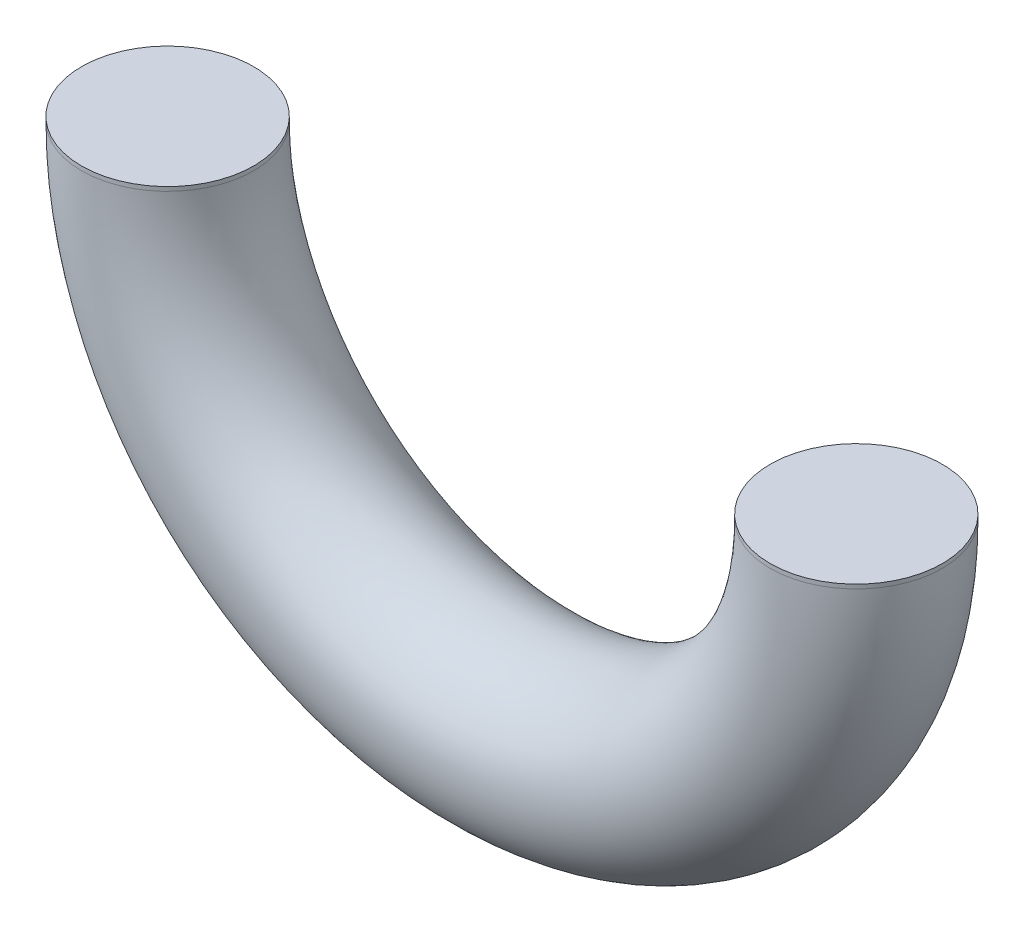
ISO-10303-21;
HEADER;
FILE_DESCRIPTION(('STEP AP214'),'2;1');
FILE_NAME('part.step','',(''),(''),'','','');
FILE_SCHEMA(('AUTOMOTIVE_DESIGN { 1 0 10303 214 1 1 1 1 }'));
ENDSEC;
DATA;
#1=APPLICATION_CONTEXT('core data for automotive mechanical design processes');
#2=APPLICATION_PROTOCOL_DEFINITION('international standard','automotive_design',2000,#1);
#3=PRODUCT_CONTEXT('',#1,'mechanical');
#4=PRODUCT('Part','Part','',(#3));
#5=PRODUCT_RELATED_PRODUCT_CATEGORY('part','',(#4));
#6=PRODUCT_DEFINITION_FORMATION('','',#4);
#7=PRODUCT_DEFINITION_CONTEXT('part definition',#1,'design');
#8=PRODUCT_DEFINITION('design','',#6,#7);
#9=PRODUCT_DEFINITION_SHAPE('','',#8);
#10=(LENGTH_UNIT() NAMED_UNIT(*) SI_UNIT(.MILLI.,.METRE.));
#11=(NAMED_UNIT(*) PLANE_ANGLE_UNIT() SI_UNIT($,.RADIAN.));
#12=(NAMED_UNIT(*) SI_UNIT($,.STERADIAN.) SOLID_ANGLE_UNIT());
#13=UNCERTAINTY_MEASURE_WITH_UNIT(LENGTH_MEASURE(1.E-05),#10,'distance_accuracy_value','');
#14=(GEOMETRIC_REPRESENTATION_CONTEXT(3) GLOBAL_UNCERTAINTY_ASSIGNED_CONTEXT((#13)) GLOBAL_UNIT_ASSIGNED_CONTEXT((#10,
#11,#12)) REPRESENTATION_CONTEXT('',''));
#15=CARTESIAN_POINT('',(0.,0.,0.));
#16=DIRECTION('',(0.,0.,1.));
#17=DIRECTION('',(1.,0.,0.));
#18=AXIS2_PLACEMENT_3D('',#15,#16,#17);
#19=CARTESIAN_POINT('',(-12.7,6.35,0.));
#20=DIRECTION('',(0.,1.,0.));
#21=DIRECTION('',(0.,0.,1.));
#22=AXIS2_PLACEMENT_3D('',#19,#20,#21);
#23=CYLINDRICAL_SURFACE('',#22,3.175);
#24=CARTESIAN_POINT('',(-12.7,0.,0.));
#25=DIRECTION('',(0.,1.,0.));
#26=DIRECTION('',(0.,0.,1.));
#27=AXIS2_PLACEMENT_3D('',#24,#25,#26);
#28=CIRCLE('',#27,3.175);
#29=CARTESIAN_POINT('',(-15.875,0.,0.));
#30=VERTEX_POINT('',#29);
#31=EDGE_CURVE('E57',#30,#30,#28,.T.);
#32=ORIENTED_EDGE('',*,*,#31,.T.);
#33=EDGE_LOOP('',(#32));
#34=FACE_BOUND('',#33,.T.);
#35=CARTESIAN_POINT('',(-12.7,0.153458333333335,0.));
#36=DIRECTION('',(0.,1.,0.));
#37=DIRECTION('',(0.,0.,1.));
#38=AXIS2_PLACEMENT_3D('',#35,#36,#37);
#39=CIRCLE('',#38,3.175);
#40=CARTESIAN_POINT('',(-12.7,0.153458333333335,3.175));
#41=VERTEX_POINT('',#40);
#42=EDGE_CURVE('E61',#41,#41,#39,.F.);
#43=ORIENTED_EDGE('',*,*,#42,.T.);
#44=EDGE_LOOP('',(#43));
#45=FACE_BOUND('',#44,.T.);
#46=ADVANCED_FACE('F50',(#34,#45),#23,.T.);
#47=CARTESIAN_POINT('',(12.7,1.77187829972172E-13,0.));
#48=DIRECTION('',(0.,1.,0.));
#49=DIRECTION('',(0.,0.,1.));
#50=AXIS2_PLACEMENT_3D('',#47,#48,#49);
#51=CYLINDRICAL_SURFACE('',#50,3.175);
#52=CARTESIAN_POINT('',(12.7,1.77187829972172E-13,0.));
#53=DIRECTION('',(0.,-1.,0.));
#54=DIRECTION('',(0.,0.,1.));
#55=AXIS2_PLACEMENT_3D('',#52,#53,#54);
#56=CIRCLE('',#55,3.175);
#57=CARTESIAN_POINT('',(15.875,2.21484787465214E-13,0.));
#58=VERTEX_POINT('',#57);
#59=EDGE_CURVE('E12',#58,#58,#56,.T.);
#60=ORIENTED_EDGE('',*,*,#59,.F.);
#61=EDGE_LOOP('',(#60));
#62=FACE_BOUND('',#61,.T.);
#63=CARTESIAN_POINT('',(12.7,0.153458333333335,0.));
#64=DIRECTION('',(0.,1.,0.));
#65=DIRECTION('',(0.,0.,1.));
#66=AXIS2_PLACEMENT_3D('',#63,#64,#65);
#67=CIRCLE('',#66,3.175);
#68=CARTESIAN_POINT('',(12.7,0.153458333333335,3.175));
#69=VERTEX_POINT('',#68);
#70=EDGE_CURVE('E53',#69,#69,#67,.T.);
#71=ORIENTED_EDGE('',*,*,#70,.F.);
#72=EDGE_LOOP('',(#71));
#73=FACE_BOUND('',#72,.T.);
#74=ADVANCED_FACE('F72',(#62,#73),#51,.T.);
#75=CARTESIAN_POINT('',(0.,0.,0.));
#76=DIRECTION('',(0.,0.,1.));
#77=DIRECTION('',(1.,0.,0.));
#78=AXIS2_PLACEMENT_3D('',#75,#76,#77);
#79=TOROIDAL_SURFACE('',#78,12.7,3.175);
#80=CARTESIAN_POINT('',(0.,0.,0.));
#81=DIRECTION('',(0.,0.,1.));
#82=DIRECTION('',(1.,0.,0.));
#83=AXIS2_PLACEMENT_3D('',#80,#81,#82);
#84=CIRCLE('',#83,15.875);
#85=EDGE_CURVE('',#30,#58,#84,.T.);
#86=ORIENTED_EDGE('',*,*,#31,.F.);
#87=ORIENTED_EDGE('',*,*,#59,.T.);
#88=ORIENTED_EDGE('',*,*,#85,.T.);
#89=ORIENTED_EDGE('',*,*,#85,.F.);
#90=EDGE_LOOP('',(#86,#88,#87,#89));
#91=FACE_BOUND('',#90,.T.);
#92=ADVANCED_FACE('F74',(#91),#79,.T.);
#93=CARTESIAN_POINT('',(0.,0.153458333333335,0.));
#94=DIRECTION('',(0.,1.,0.));
#95=DIRECTION('',(0.,0.,1.));
#96=AXIS2_PLACEMENT_3D('',#93,#94,#95);
#97=PLANE('',#96);
#98=ORIENTED_EDGE('',*,*,#70,.T.);
#99=EDGE_LOOP('',(#98));
#100=FACE_BOUND('',#99,.T.);
#101=ADVANCED_FACE('F70',(#100),#97,.T.);
#102=ORIENTED_EDGE('',*,*,#42,.F.);
#103=EDGE_LOOP('',(#102));
#104=FACE_BOUND('',#103,.T.);
#105=ADVANCED_FACE('F85',(#104),#97,.T.);
#106=CLOSED_SHELL('',(#46,#74,#92,#101,#105));
#107=MANIFOLD_SOLID_BREP('B2',#106);
#108=ADVANCED_BREP_SHAPE_REPRESENTATION('',(#18,#107),#14);
#109=SHAPE_DEFINITION_REPRESENTATION(#9,#108);
ENDSEC;
END-ISO-10303-21;
